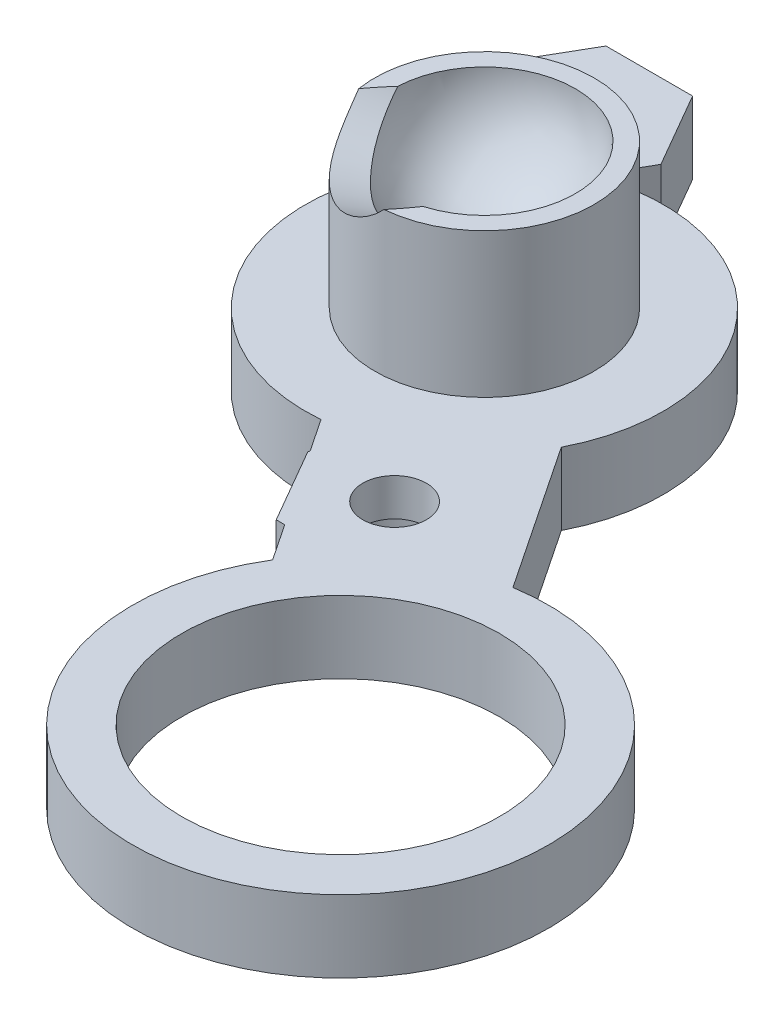
ISO-10303-21;
HEADER;
FILE_DESCRIPTION(('STEP AP214'),'2;1');
FILE_NAME('part.step','',(''),(''),'','','');
FILE_SCHEMA(('AUTOMOTIVE_DESIGN { 1 0 10303 214 1 1 1 1 }'));
ENDSEC;
DATA;
#1=APPLICATION_CONTEXT('core data for automotive mechanical design processes');
#2=APPLICATION_PROTOCOL_DEFINITION('international standard','automotive_design',2000,#1);
#3=PRODUCT_CONTEXT('',#1,'mechanical');
#4=PRODUCT('Part','Part','',(#3));
#5=PRODUCT_RELATED_PRODUCT_CATEGORY('part','',(#4));
#6=PRODUCT_DEFINITION_FORMATION('','',#4);
#7=PRODUCT_DEFINITION_CONTEXT('part definition',#1,'design');
#8=PRODUCT_DEFINITION('design','',#6,#7);
#9=PRODUCT_DEFINITION_SHAPE('','',#8);
#10=(LENGTH_UNIT() NAMED_UNIT(*) SI_UNIT(.MILLI.,.METRE.));
#11=(NAMED_UNIT(*) PLANE_ANGLE_UNIT() SI_UNIT($,.RADIAN.));
#12=(NAMED_UNIT(*) SI_UNIT($,.STERADIAN.) SOLID_ANGLE_UNIT());
#13=UNCERTAINTY_MEASURE_WITH_UNIT(LENGTH_MEASURE(1.E-05),#10,'distance_accuracy_value','');
#14=(GEOMETRIC_REPRESENTATION_CONTEXT(3) GLOBAL_UNCERTAINTY_ASSIGNED_CONTEXT((#13)) GLOBAL_UNIT_ASSIGNED_CONTEXT((#10,
#11,#12)) REPRESENTATION_CONTEXT('',''));
#15=CARTESIAN_POINT('',(0.,0.,0.));
#16=DIRECTION('',(0.,0.,1.));
#17=DIRECTION('',(1.,0.,0.));
#18=AXIS2_PLACEMENT_3D('',#15,#16,#17);
#19=CARTESIAN_POINT('',(-26.0608891324554,-108.75,-7.63878406783228));
#20=DIRECTION('',(0.,1.,0.));
#21=DIRECTION('',(0.,0.,1.));
#22=AXIS2_PLACEMENT_3D('',#19,#20,#21);
#23=CYLINDRICAL_SURFACE('',#22,1.1);
#24=CARTESIAN_POINT('',(-26.0608891324554,-106.,-7.63878406783228));
#25=DIRECTION('',(0.,-1.,0.));
#26=DIRECTION('',(0.,0.,-1.));
#27=AXIS2_PLACEMENT_3D('',#24,#25,#26);
#28=CIRCLE('',#27,1.1);
#29=CARTESIAN_POINT('',(-26.0608891324554,-106.,-8.73878406783228));
#30=VERTEX_POINT('',#29);
#31=EDGE_CURVE('E203',#30,#30,#28,.F.);
#32=ORIENTED_EDGE('',*,*,#31,.T.);
#33=EDGE_LOOP('',(#32));
#34=FACE_BOUND('',#33,.T.);
#35=CARTESIAN_POINT('',(-26.0608891324554,-107.3,-7.63878406783228));
#36=DIRECTION('',(0.,-1.,0.));
#37=DIRECTION('',(0.,0.,-1.));
#38=AXIS2_PLACEMENT_3D('',#35,#36,#37);
#39=CIRCLE('',#38,1.1);
#40=CARTESIAN_POINT('',(-26.0608891324554,-107.3,-8.73878406783228));
#41=VERTEX_POINT('',#40);
#42=EDGE_CURVE('E210',#41,#41,#39,.T.);
#43=ORIENTED_EDGE('',*,*,#42,.T.);
#44=EDGE_LOOP('',(#43));
#45=FACE_BOUND('',#44,.T.);
#46=ADVANCED_FACE('F41',(#34,#45),#23,.F.);
#47=CARTESIAN_POINT('',(-34.5608891324554,-108.75,-22.3612159321677));
#48=DIRECTION('',(0.,1.,0.));
#49=DIRECTION('',(0.,0.,1.));
#50=AXIS2_PLACEMENT_3D('',#47,#48,#49);
#51=CYLINDRICAL_SURFACE('',#50,1.1);
#52=CARTESIAN_POINT('',(-34.5608891324554,-106.,-22.3612159321677));
#53=DIRECTION('',(0.,-1.,0.));
#54=DIRECTION('',(0.,0.,-1.));
#55=AXIS2_PLACEMENT_3D('',#52,#53,#54);
#56=CIRCLE('',#55,1.1);
#57=CARTESIAN_POINT('',(-34.5608891324554,-106.,-23.4612159321677));
#58=VERTEX_POINT('',#57);
#59=EDGE_CURVE('E195',#58,#58,#56,.F.);
#60=ORIENTED_EDGE('',*,*,#59,.T.);
#61=EDGE_LOOP('',(#60));
#62=FACE_BOUND('',#61,.T.);
#63=CARTESIAN_POINT('',(-34.5608891324554,-107.3,-22.3612159321677));
#64=DIRECTION('',(0.,-1.,0.));
#65=DIRECTION('',(0.,0.,-1.));
#66=AXIS2_PLACEMENT_3D('',#63,#64,#65);
#67=CIRCLE('',#66,1.1);
#68=CARTESIAN_POINT('',(-34.5608891324554,-107.3,-23.4612159321677));
#69=VERTEX_POINT('',#68);
#70=EDGE_CURVE('E200',#69,#69,#67,.T.);
#71=ORIENTED_EDGE('',*,*,#70,.T.);
#72=EDGE_LOOP('',(#71));
#73=FACE_BOUND('',#72,.T.);
#74=ADVANCED_FACE('F346',(#62,#73),#51,.F.);
#75=CARTESIAN_POINT('',(-22.7863244619095,-108.5,1.66631495995398));
#76=DIRECTION('',(0.83155773864033,0.,-0.555438319984659));
#77=DIRECTION('',(-0.555438319984659,0.,-0.83155773864033));
#78=AXIS2_PLACEMENT_3D('',#75,#76,#77);
#79=PLANE('',#78);
#80=DIRECTION('',(0.,1.,0.));
#81=VECTOR('',#80,1.);
#82=CARTESIAN_POINT('',(-26.4217944999992,-108.5,-3.77641942656093));
#83=LINE('',#82,#81);
#84=CARTESIAN_POINT('',(-26.4217944999992,-106.,-3.77641942656093));
#85=VERTEX_POINT('',#84);
#86=CARTESIAN_POINT('',(-26.4217944999992,-108.5,-3.77641942656093));
#87=VERTEX_POINT('',#86);
#88=EDGE_CURVE('E241',#85,#87,#83,.F.);
#89=ORIENTED_EDGE('',*,*,#88,.F.);
#90=DIRECTION('',(-0.555438319984659,0.,-0.83155773864033));
#91=VECTOR('',#90,1.);
#92=CARTESIAN_POINT('',(-22.7863244619095,-106.,1.66631495995398));
#93=LINE('',#92,#91);
#94=CARTESIAN_POINT('',(-27.266274935763,-106.,-5.04070785647896));
#95=VERTEX_POINT('',#94);
#96=EDGE_CURVE('E249',#85,#95,#93,.T.);
#97=ORIENTED_EDGE('',*,*,#96,.T.);
#98=DIRECTION('',(0.,-1.,0.));
#99=VECTOR('',#98,1.);
#100=CARTESIAN_POINT('',(-27.266274935763,-108.5,-5.04070785647896));
#101=LINE('',#100,#99);
#102=CARTESIAN_POINT('',(-27.266274935763,-108.5,-5.04070785647896));
#103=VERTEX_POINT('',#102);
#104=EDGE_CURVE('E184',#95,#103,#101,.T.);
#105=ORIENTED_EDGE('',*,*,#104,.T.);
#106=DIRECTION('',(-0.555438319984659,0.,-0.83155773864033));
#107=VECTOR('',#106,1.);
#108=CARTESIAN_POINT('',(-22.7863244619095,-108.5,1.66631495995398));
#109=LINE('',#108,#107);
#110=EDGE_CURVE('E63',#87,#103,#109,.T.);
#111=ORIENTED_EDGE('',*,*,#110,.F.);
#112=EDGE_LOOP('',(#89,#97,#105,#111));
#113=FACE_BOUND('',#112,.T.);
#114=ADVANCED_FACE('F358',(#113),#79,.F.);
#115=CARTESIAN_POINT('',(-27.8162159165344,-108.5,-16.666314959954));
#116=DIRECTION('',(-0.83155773864033,0.,0.555438319984659));
#117=DIRECTION('',(0.555438319984659,0.,0.83155773864033));
#118=AXIS2_PLACEMENT_3D('',#115,#116,#117);
#119=PLANE('',#118);
#120=DIRECTION('',(0.,1.,0.));
#121=VECTOR('',#120,1.);
#122=CARTESIAN_POINT('',(-21.4324480681573,-108.5,-7.10904934646889));
#123=LINE('',#122,#121);
#124=CARTESIAN_POINT('',(-21.4324480681573,-108.5,-7.10904934646889));
#125=VERTEX_POINT('',#124);
#126=CARTESIAN_POINT('',(-21.4324480681573,-106.,-7.10904934646889));
#127=VERTEX_POINT('',#126);
#128=EDGE_CURVE('E49',#125,#127,#123,.T.);
#129=ORIENTED_EDGE('',*,*,#128,.F.);
#130=DIRECTION('',(0.555438319984659,0.,0.83155773864033));
#131=VECTOR('',#130,1.);
#132=CARTESIAN_POINT('',(-27.8162159165344,-108.5,-16.666314959954));
#133=LINE('',#132,#131);
#134=CARTESIAN_POINT('',(-24.8024831394074,-108.5,-12.1543957731699));
#135=VERTEX_POINT('',#134);
#136=EDGE_CURVE('E246',#135,#125,#133,.T.);
#137=ORIENTED_EDGE('',*,*,#136,.F.);
#138=DIRECTION('',(0.,1.,0.));
#139=VECTOR('',#138,1.);
#140=CARTESIAN_POINT('',(-24.8024831394074,-108.5,-12.1543957731699));
#141=LINE('',#140,#139);
#142=CARTESIAN_POINT('',(-24.8024831394074,-106.,-12.1543957731699));
#143=VERTEX_POINT('',#142);
#144=EDGE_CURVE('E172',#135,#143,#141,.T.);
#145=ORIENTED_EDGE('',*,*,#144,.T.);
#146=DIRECTION('',(0.555438319984659,0.,0.83155773864033));
#147=VECTOR('',#146,1.);
#148=CARTESIAN_POINT('',(-27.8162159165344,-106.,-16.666314959954));
#149=LINE('',#148,#147);
#150=EDGE_CURVE('E244',#143,#127,#149,.T.);
#151=ORIENTED_EDGE('',*,*,#150,.T.);
#152=EDGE_LOOP('',(#129,#137,#145,#151));
#153=FACE_BOUND('',#152,.T.);
#154=ADVANCED_FACE('F382',(#153),#119,.F.);
#155=CARTESIAN_POINT('',(-30.3108891324554,-108.5,-15.));
#156=DIRECTION('',(0.,1.,0.));
#157=DIRECTION('',(0.,0.,1.));
#158=AXIS2_PLACEMENT_3D('',#155,#156,#157);
#159=CYLINDRICAL_SURFACE('',#158,6.2);
#160=DIRECTION('',(0.,1.,0.));
#161=VECTOR('',#160,1.);
#162=CARTESIAN_POINT('',(-29.7918295712494,-108.5,-8.8217658532619));
#163=LINE('',#162,#161);
#164=CARTESIAN_POINT('',(-29.7918295712494,-106.,-8.8217658532619));
#165=VERTEX_POINT('',#164);
#166=CARTESIAN_POINT('',(-29.7918295712494,-108.5,-8.8217658532619));
#167=VERTEX_POINT('',#166);
#168=EDGE_CURVE('E177',#165,#167,#163,.F.);
#169=ORIENTED_EDGE('',*,*,#168,.F.);
#170=CARTESIAN_POINT('',(-30.3108891324554,-106.,-15.));
#171=DIRECTION('',(0.,-1.,0.));
#172=DIRECTION('',(0.,0.,-1.));
#173=AXIS2_PLACEMENT_3D('',#170,#171,#172);
#174=CIRCLE('',#173,6.2);
#175=CARTESIAN_POINT('',(-34.2798310569486,-106.,-19.7631397208144));
#176=VERTEX_POINT('',#175);
#177=EDGE_CURVE('E322',#165,#176,#174,.T.);
#178=ORIENTED_EDGE('',*,*,#177,.T.);
#179=DIRECTION('',(0.,1.,0.));
#180=VECTOR('',#179,1.);
#181=CARTESIAN_POINT('',(-34.2798310569486,-108.5,-19.7631397208144));
#182=LINE('',#181,#180);
#183=CARTESIAN_POINT('',(-34.2798310569486,-108.5,-19.7631397208144));
#184=VERTEX_POINT('',#183);
#185=EDGE_CURVE('E316',#184,#176,#182,.T.);
#186=ORIENTED_EDGE('',*,*,#185,.F.);
#187=CARTESIAN_POINT('',(-30.3108891324554,-108.5,-15.));
#188=DIRECTION('',(0.,-1.,0.));
#189=DIRECTION('',(0.,0.,-1.));
#190=AXIS2_PLACEMENT_3D('',#187,#188,#189);
#191=CIRCLE('',#190,6.2);
#192=EDGE_CURVE('E329',#167,#184,#191,.T.);
#193=ORIENTED_EDGE('',*,*,#192,.F.);
#194=EDGE_LOOP('',(#169,#178,#186,#193));
#195=FACE_BOUND('',#194,.T.);
#196=ADVANCED_FACE('F381',(#195),#159,.T.);
#197=ORIENTED_EDGE('',*,*,#144,.F.);
#198=CARTESIAN_POINT('',(-32.4514181702087,-108.5,-20.8187743931635));
#199=VERTEX_POINT('',#198);
#200=EDGE_CURVE('E328',#199,#135,#191,.T.);
#201=ORIENTED_EDGE('',*,*,#200,.F.);
#202=DIRECTION('',(0.,1.,0.));
#203=VECTOR('',#202,1.);
#204=CARTESIAN_POINT('',(-32.4514181702087,-108.5,-20.8187743931635));
#205=LINE('',#204,#203);
#206=CARTESIAN_POINT('',(-32.4514181702087,-106.,-20.8187743931635));
#207=VERTEX_POINT('',#206);
#208=EDGE_CURVE('E321',#207,#199,#205,.F.);
#209=ORIENTED_EDGE('',*,*,#208,.F.);
#210=EDGE_CURVE('E327',#207,#143,#174,.T.);
#211=ORIENTED_EDGE('',*,*,#210,.T.);
#212=EDGE_LOOP('',(#197,#201,#209,#211));
#213=FACE_BOUND('',#212,.T.);
#214=ADVANCED_FACE('F393',(#213),#159,.T.);
#215=CARTESIAN_POINT('',(-29.0608891324554,-108.5,-7.63878406783228));
#216=DIRECTION('',(0.866025403784438,0.,0.5));
#217=DIRECTION('',(0.5,0.,-0.866025403784438));
#218=AXIS2_PLACEMENT_3D('',#215,#216,#217);
#219=PLANE('',#218);
#220=DIRECTION('',(0.,1.,0.));
#221=VECTOR('',#220,1.);
#222=CARTESIAN_POINT('',(-29.0334281064459,-108.5,-7.68634796010869));
#223=LINE('',#222,#221);
#224=CARTESIAN_POINT('',(-29.0334281064459,-108.5,-7.68634796010869));
#225=VERTEX_POINT('',#224);
#226=CARTESIAN_POINT('',(-29.0334281064459,-106.,-7.68634796010869));
#227=VERTEX_POINT('',#226);
#228=EDGE_CURVE('E255',#225,#227,#223,.T.);
#229=ORIENTED_EDGE('',*,*,#228,.F.);
#230=DIRECTION('',(0.5,0.,-0.866025403784438));
#231=VECTOR('',#230,1.);
#232=CARTESIAN_POINT('',(-29.0608891324554,-108.5,-7.63878406783228));
#233=LINE('',#232,#231);
#234=CARTESIAN_POINT('',(-29.0608891324554,-108.5,-7.63878406783228));
#235=VERTEX_POINT('',#234);
#236=EDGE_CURVE('E262',#235,#225,#233,.T.);
#237=ORIENTED_EDGE('',*,*,#236,.F.);
#238=DIRECTION('',(0.,1.,0.));
#239=VECTOR('',#238,1.);
#240=CARTESIAN_POINT('',(-29.0608891324554,-108.5,-7.63878406783228));
#241=LINE('',#240,#239);
#242=CARTESIAN_POINT('',(-29.0608891324554,-106.,-7.63878406783228));
#243=VERTEX_POINT('',#242);
#244=EDGE_CURVE('E270',#235,#243,#241,.T.);
#245=ORIENTED_EDGE('',*,*,#244,.T.);
#246=DIRECTION('',(0.5,0.,-0.866025403784438));
#247=VECTOR('',#246,1.);
#248=CARTESIAN_POINT('',(-29.0608891324554,-106.,-7.63878406783228));
#249=LINE('',#248,#247);
#250=EDGE_CURVE('E261',#243,#227,#249,.T.);
#251=ORIENTED_EDGE('',*,*,#250,.T.);
#252=EDGE_LOOP('',(#229,#237,#245,#251));
#253=FACE_BOUND('',#252,.T.);
#254=ADVANCED_FACE('F343',(#253),#219,.F.);
#255=CARTESIAN_POINT('',(-24.5608891324554,-108.5,-5.04070785647896));
#256=DIRECTION('',(0.,0.,-1.));
#257=DIRECTION('',(-1.,0.,0.));
#258=AXIS2_PLACEMENT_3D('',#255,#256,#257);
#259=PLANE('',#258);
#260=ORIENTED_EDGE('',*,*,#104,.F.);
#261=DIRECTION('',(-1.,0.,0.));
#262=VECTOR('',#261,1.);
#263=CARTESIAN_POINT('',(-24.5608891324554,-106.,-5.04070785647896));
#264=LINE('',#263,#262);
#265=CARTESIAN_POINT('',(-27.5608891324554,-106.,-5.04070785647896));
#266=VERTEX_POINT('',#265);
#267=EDGE_CURVE('E173',#95,#266,#264,.T.);
#268=ORIENTED_EDGE('',*,*,#267,.T.);
#269=DIRECTION('',(0.,1.,0.));
#270=VECTOR('',#269,1.);
#271=CARTESIAN_POINT('',(-27.5608891324554,-108.5,-5.04070785647896));
#272=LINE('',#271,#270);
#273=CARTESIAN_POINT('',(-27.5608891324554,-108.5,-5.04070785647896));
#274=VERTEX_POINT('',#273);
#275=EDGE_CURVE('E271',#274,#266,#272,.T.);
#276=ORIENTED_EDGE('',*,*,#275,.F.);
#277=DIRECTION('',(-1.,0.,0.));
#278=VECTOR('',#277,1.);
#279=CARTESIAN_POINT('',(-24.5608891324554,-108.5,-5.04070785647896));
#280=LINE('',#279,#278);
#281=EDGE_CURVE('E257',#103,#274,#280,.T.);
#282=ORIENTED_EDGE('',*,*,#281,.F.);
#283=EDGE_LOOP('',(#260,#268,#276,#282));
#284=FACE_BOUND('',#283,.T.);
#285=ADVANCED_FACE('F336',(#284),#259,.F.);
#286=CARTESIAN_POINT('',(-30.3108891324554,-106.02,-15.));
#287=DIRECTION('',(0.,1.,0.));
#288=DIRECTION('',(0.,0.,1.));
#289=AXIS2_PLACEMENT_3D('',#286,#287,#288);
#290=CYLINDRICAL_SURFACE('',#289,3.8);
#291=CARTESIAN_POINT('',(-30.3108891324554,-101.,-15.));
#292=DIRECTION('',(0.,-1.,0.));
#293=DIRECTION('',(0.,0.,-1.));
#294=AXIS2_PLACEMENT_3D('',#291,#292,#293);
#295=CIRCLE('',#294,3.8);
#296=CARTESIAN_POINT('',(-34.0630722359518,-101.,-14.3990657624698));
#297=VERTEX_POINT('',#296);
#298=CARTESIAN_POINT('',(-29.9992809717437,-101.,-11.2127978197385));
#299=VERTEX_POINT('',#298);
#300=EDGE_CURVE('E169',#297,#299,#295,.T.);
#301=ORIENTED_EDGE('',*,*,#300,.T.);
#302=CARTESIAN_POINT('',(-29.9990936060594,-100.9998,-11.2128132407129));
#303=CARTESIAN_POINT('',(-30.0670392282905,-101.072342110152,-11.2071924317569));
#304=CARTESIAN_POINT('',(-30.1384427308652,-101.141737029236,-11.2031800244121));
#305=CARTESIAN_POINT('',(-30.2870375597555,-101.2741615165,-11.1993554575045));
#306=CARTESIAN_POINT('',(-30.3642290028478,-101.337190956191,-11.1995433827097));
#307=CARTESIAN_POINT('',(-30.5233696196391,-101.456886305187,-11.2051067512917));
#308=CARTESIAN_POINT('',(-30.6053246932024,-101.513544056817,-11.2104887621023));
#309=CARTESIAN_POINT('',(-30.7727850652044,-101.620336946865,-11.2272389157684));
#310=CARTESIAN_POINT('',(-30.8582897715052,-101.670473167462,-11.23860606387));
#311=CARTESIAN_POINT('',(-31.0216894112094,-101.75869968596,-11.2662599660654));
#312=CARTESIAN_POINT('',(-31.0993178157952,-101.797512633648,-11.2818238865246));
#313=CARTESIAN_POINT('',(-31.2557187213186,-101.86987515176,-11.3184588376373));
#314=CARTESIAN_POINT('',(-31.3344911058838,-101.903425253509,-11.3395293117879));
#315=CARTESIAN_POINT('',(-31.4922763385444,-101.96510164616,-11.3873679983923));
#316=CARTESIAN_POINT('',(-31.571288604743,-101.9932364806,-11.4141270932981));
#317=CARTESIAN_POINT('',(-31.728886955565,-102.044024535532,-11.4734761286719));
#318=CARTESIAN_POINT('',(-31.8074730591716,-102.066678002182,-11.5060658071858));
#319=CARTESIAN_POINT('',(-31.9595066922925,-102.105385136737,-11.5752835984315));
#320=CARTESIAN_POINT('',(-32.0330141390325,-102.121713025434,-11.6116268569451));
#321=CARTESIAN_POINT('',(-32.1782807288927,-102.149229670343,-11.6894649814123));
#322=CARTESIAN_POINT('',(-32.2500392185365,-102.160416532726,-11.730961738651));
#323=CARTESIAN_POINT('',(-32.3911105144319,-102.17756924396,-11.8188713638396));
#324=CARTESIAN_POINT('',(-32.4604239519339,-102.183536450003,-11.865282950337));
#325=CARTESIAN_POINT('',(-32.5960174010497,-102.190221249505,-11.9627025238169));
#326=CARTESIAN_POINT('',(-32.6622963284864,-102.190936981028,-12.013712134564));
#327=CARTESIAN_POINT('',(-32.8472967398228,-102.185424591192,-12.1661119153657));
#328=CARTESIAN_POINT('',(-32.9615974696543,-102.172629334172,-12.2727976450869));
#329=CARTESIAN_POINT('',(-33.1745270586437,-102.128913957544,-12.4972898067947));
#330=CARTESIAN_POINT('',(-33.2731601317283,-102.09799872196,-12.6150932349635));
#331=CARTESIAN_POINT('',(-33.4533840421461,-102.018550534102,-12.8581161439467));
#332=CARTESIAN_POINT('',(-33.5349255115896,-101.969967626041,-12.9833558022623));
#333=CARTESIAN_POINT('',(-33.6801021732066,-101.855858350757,-13.236556615624));
#334=CARTESIAN_POINT('',(-33.7437224355728,-101.790317943255,-13.3645199448262));
#335=CARTESIAN_POINT('',(-33.8571883347709,-101.638024621455,-13.6268602833714));
#336=CARTESIAN_POINT('',(-33.9058429852257,-101.550154500005,-13.7611009471761));
#337=CARTESIAN_POINT('',(-33.985209486157,-101.356314064967,-14.0213209405645));
#338=CARTESIAN_POINT('',(-34.0159551600863,-101.250378363221,-14.1473154418161));
#339=CARTESIAN_POINT('',(-34.0438114477498,-101.113686188711,-14.2887764793012));
#340=CARTESIAN_POINT('',(-34.0480257754014,-101.091350519122,-14.3112884456115));
#341=CARTESIAN_POINT('',(-34.0559398230363,-101.046051944822,-14.3557176626996));
#342=CARTESIAN_POINT('',(-34.0596400621782,-101.023089701324,-14.3776354951944));
#343=CARTESIAN_POINT('',(-34.063101961667,-100.9998,-14.3992513967554));
#344=B_SPLINE_CURVE_WITH_KNOTS('',3,(#302,#303,#304,#305,#306,#307,#308,#309,#310,#311,#312,
#313,#314,#315,#316,#317,#318,#319,#320,#321,#322,#323,#324,#325,#326,#327,#328,#329,#330,#331,
#332,#333,#334,#335,#336,#337,#338,#339,#340,#341,#342,#343),.UNSPECIFIED.,.F.,.F.,(4,2,2,2,2,2,
2,2,2,2,2,2,2,2,2,2,2,2,2,2,4),(0.,0.298502367110102,0.597010758387164,0.895897080679035,
1.19473374252968,1.45893687456312,1.72311331603081,1.9868694935179,2.25061382405023,
2.50111827840569,2.75171493870102,3.00224642058703,3.25286672539199,3.72104449842141,
4.18909613775274,4.65848162776413,5.12825700492775,5.62913773764794,6.12906939821765,
6.22503537633674,6.32090372644162),.UNSPECIFIED.);
#345=EDGE_CURVE('E167',#299,#297,#344,.T.);
#346=ORIENTED_EDGE('',*,*,#345,.T.);
#347=EDGE_LOOP('',(#301,#346));
#348=FACE_BOUND('',#347,.T.);
#349=CARTESIAN_POINT('',(-30.3108891324554,-106.,-15.));
#350=DIRECTION('',(0.,-1.,0.));
#351=DIRECTION('',(0.,0.,-1.));
#352=AXIS2_PLACEMENT_3D('',#349,#350,#351);
#353=CIRCLE('',#352,3.8);
#354=CARTESIAN_POINT('',(-30.3108891324554,-106.,-18.8));
#355=VERTEX_POINT('',#354);
#356=EDGE_CURVE('E182',#355,#355,#353,.T.);
#357=ORIENTED_EDGE('',*,*,#356,.F.);
#358=EDGE_LOOP('',(#357));
#359=FACE_BOUND('',#358,.T.);
#360=ADVANCED_FACE('F43',(#348,#359),#290,.T.);
#361=CARTESIAN_POINT('',(-30.3108891324554,-101.,-15.));
#362=DIRECTION('',(0.,-1.,0.));
#363=DIRECTION('',(0.,0.,-1.));
#364=AXIS2_PLACEMENT_3D('',#361,#362,#363);
#365=PLANE('',#364);
#366=ORIENTED_EDGE('',*,*,#300,.F.);
#367=CARTESIAN_POINT('',(-31.835817099933,-101.,-13.0550948431946));
#368=DIRECTION('',(0.,-1.,0.));
#369=DIRECTION('',(-0.617017715423195,0.,0.786949260660394));
#370=AXIS2_PLACEMENT_3D('',#367,#368,#369);
#371=ELLIPSE('',#370,5.40311255334571,2.58643522865266);
#372=CARTESIAN_POINT('',(-33.4573814589928,-101.,-15.1486137242689));
#373=VERTEX_POINT('',#372);
#374=EDGE_CURVE('E159',#297,#373,#371,.T.);
#375=ORIENTED_EDGE('',*,*,#374,.T.);
#376=CARTESIAN_POINT('',(-30.3108891324554,-101.,-15.));
#377=DIRECTION('',(0.,-1.,0.));
#378=DIRECTION('',(0.,0.,-1.));
#379=AXIS2_PLACEMENT_3D('',#376,#377,#378);
#380=CIRCLE('',#379,3.15);
#381=CARTESIAN_POINT('',(-29.4158821665001,-101.,-11.9798240894128));
#382=VERTEX_POINT('',#381);
#383=EDGE_CURVE('E170',#373,#382,#380,.T.);
#384=ORIENTED_EDGE('',*,*,#383,.T.);
#385=EDGE_CURVE('E60',#382,#299,#371,.T.);
#386=ORIENTED_EDGE('',*,*,#385,.T.);
#387=EDGE_LOOP('',(#366,#375,#384,#386));
#388=FACE_BOUND('',#387,.T.);
#389=ADVANCED_FACE('F168',(#388),#365,.F.);
#390=CARTESIAN_POINT('',(-30.3108891324554,-108.5,-15.));
#391=DIRECTION('',(0.,-1.,0.));
#392=DIRECTION('',(0.,0.,-1.));
#393=AXIS2_PLACEMENT_3D('',#390,#391,#392);
#394=PLANE('',#393);
#395=CARTESIAN_POINT('',(-26.0608891324554,-108.5,-7.63878406783228));
#396=DIRECTION('',(0.,-1.,0.));
#397=DIRECTION('',(0.,0.,-1.));
#398=AXIS2_PLACEMENT_3D('',#395,#396,#397);
#399=CIRCLE('',#398,2.1);
#400=CARTESIAN_POINT('',(-26.0608891324554,-108.5,-9.73878406783228));
#401=VERTEX_POINT('',#400);
#402=EDGE_CURVE('E207',#401,#401,#399,.F.);
#403=ORIENTED_EDGE('',*,*,#402,.T.);
#404=EDGE_LOOP('',(#403));
#405=FACE_BOUND('',#404,.T.);
#406=CARTESIAN_POINT('',(-34.5608891324554,-108.5,-22.3612159321677));
#407=DIRECTION('',(0.,-1.,0.));
#408=DIRECTION('',(0.,0.,-1.));
#409=AXIS2_PLACEMENT_3D('',#406,#407,#408);
#410=CIRCLE('',#409,2.1);
#411=CARTESIAN_POINT('',(-34.5608891324554,-108.5,-24.4612159321677));
#412=VERTEX_POINT('',#411);
#413=EDGE_CURVE('E198',#412,#412,#410,.F.);
#414=ORIENTED_EDGE('',*,*,#413,.T.);
#415=EDGE_LOOP('',(#414));
#416=FACE_BOUND('',#415,.T.);
#417=CARTESIAN_POINT('',(-20.2916512459885,-108.5,0.));
#418=DIRECTION('',(0.,-1.,0.));
#419=DIRECTION('',(0.,0.,-1.));
#420=AXIS2_PLACEMENT_3D('',#417,#418,#419);
#421=CIRCLE('',#420,5.5);
#422=CARTESIAN_POINT('',(-20.2916512459885,-108.5,5.5));
#423=VERTEX_POINT('',#422);
#424=EDGE_CURVE('E191',#423,#423,#421,.F.);
#425=ORIENTED_EDGE('',*,*,#424,.T.);
#426=EDGE_LOOP('',(#425));
#427=FACE_BOUND('',#426,.T.);
#428=CARTESIAN_POINT('',(-20.2916512459885,-108.5,0.));
#429=DIRECTION('',(0.,-1.,0.));
#430=DIRECTION('',(0.,0.,-1.));
#431=AXIS2_PLACEMENT_3D('',#428,#429,#430);
#432=CIRCLE('',#431,7.2);
#433=EDGE_CURVE('E238',#125,#87,#432,.T.);
#434=ORIENTED_EDGE('',*,*,#433,.T.);
#435=ORIENTED_EDGE('',*,*,#110,.T.);
#436=ORIENTED_EDGE('',*,*,#281,.T.);
#437=DIRECTION('',(-0.5,0.,-0.866025403784439));
#438=VECTOR('',#437,1.);
#439=CARTESIAN_POINT('',(-27.5608891324554,-108.5,-5.04070785647896));
#440=LINE('',#439,#438);
#441=EDGE_CURVE('E265',#274,#235,#440,.T.);
#442=ORIENTED_EDGE('',*,*,#441,.T.);
#443=ORIENTED_EDGE('',*,*,#236,.T.);
#444=EDGE_CURVE('E248',#225,#167,#109,.T.);
#445=ORIENTED_EDGE('',*,*,#444,.T.);
#446=ORIENTED_EDGE('',*,*,#192,.T.);
#447=DIRECTION('',(-1.,0.,0.));
#448=VECTOR('',#447,1.);
#449=CARTESIAN_POINT('',(-33.0608891324554,-108.5,-19.7631397208144));
#450=LINE('',#449,#448);
#451=CARTESIAN_POINT('',(-36.0608891324554,-108.5,-19.7631397208144));
#452=VERTEX_POINT('',#451);
#453=EDGE_CURVE('E284',#184,#452,#450,.T.);
#454=ORIENTED_EDGE('',*,*,#453,.T.);
#455=DIRECTION('',(-0.5,0.,-0.866025403784439));
#456=VECTOR('',#455,1.);
#457=CARTESIAN_POINT('',(-36.0608891324554,-108.5,-19.7631397208144));
#458=LINE('',#457,#456);
#459=CARTESIAN_POINT('',(-37.5608891324554,-108.5,-22.3612159321677));
#460=VERTEX_POINT('',#459);
#461=EDGE_CURVE('E287',#452,#460,#458,.T.);
#462=ORIENTED_EDGE('',*,*,#461,.T.);
#463=DIRECTION('',(0.500000000000001,0.,-0.866025403784438));
#464=VECTOR('',#463,1.);
#465=CARTESIAN_POINT('',(-37.5608891324554,-108.5,-22.3612159321677));
#466=LINE('',#465,#464);
#467=CARTESIAN_POINT('',(-36.0608891324554,-108.5,-24.9592921435211));
#468=VERTEX_POINT('',#467);
#469=EDGE_CURVE('E288',#460,#468,#466,.T.);
#470=ORIENTED_EDGE('',*,*,#469,.T.);
#471=DIRECTION('',(1.,0.,0.));
#472=VECTOR('',#471,1.);
#473=CARTESIAN_POINT('',(-36.0608891324554,-108.5,-24.9592921435211));
#474=LINE('',#473,#472);
#475=CARTESIAN_POINT('',(-33.0608891324554,-108.5,-24.9592921435211));
#476=VERTEX_POINT('',#475);
#477=EDGE_CURVE('E286',#468,#476,#474,.T.);
#478=ORIENTED_EDGE('',*,*,#477,.T.);
#479=DIRECTION('',(0.500000000000001,0.,0.866025403784438));
#480=VECTOR('',#479,1.);
#481=CARTESIAN_POINT('',(-33.0608891324554,-108.5,-24.9592921435211));
#482=LINE('',#481,#480);
#483=CARTESIAN_POINT('',(-31.5608891324554,-108.5,-22.3612159321677));
#484=VERTEX_POINT('',#483);
#485=EDGE_CURVE('E276',#476,#484,#482,.T.);
#486=ORIENTED_EDGE('',*,*,#485,.T.);
#487=DIRECTION('',(-0.5,0.,0.866025403784439));
#488=VECTOR('',#487,1.);
#489=CARTESIAN_POINT('',(-31.5608891324554,-108.5,-22.3612159321677));
#490=LINE('',#489,#488);
#491=EDGE_CURVE('E277',#484,#199,#490,.T.);
#492=ORIENTED_EDGE('',*,*,#491,.T.);
#493=ORIENTED_EDGE('',*,*,#200,.T.);
#494=ORIENTED_EDGE('',*,*,#136,.T.);
#495=EDGE_LOOP('',(#434,#435,#436,#442,#443,#445,#446,#454,#462,#470,#478,#486,#492,#493,#494));
#496=FACE_BOUND('',#495,.T.);
#497=ADVANCED_FACE('F215',(#405,#416,#427,#496),#394,.T.);
#498=CARTESIAN_POINT('',(-30.3108891324554,-106.,-15.));
#499=DIRECTION('',(0.,-1.,0.));
#500=DIRECTION('',(0.,0.,-1.));
#501=AXIS2_PLACEMENT_3D('',#498,#499,#500);
#502=PLANE('',#501);
#503=ORIENTED_EDGE('',*,*,#31,.F.);
#504=EDGE_LOOP('',(#503));
#505=FACE_BOUND('',#504,.T.);
#506=ORIENTED_EDGE('',*,*,#59,.F.);
#507=EDGE_LOOP('',(#506));
#508=FACE_BOUND('',#507,.T.);
#509=CARTESIAN_POINT('',(-20.2916512459885,-106.,0.));
#510=DIRECTION('',(0.,-1.,0.));
#511=DIRECTION('',(0.,0.,-1.));
#512=AXIS2_PLACEMENT_3D('',#509,#510,#511);
#513=CIRCLE('',#512,5.5);
#514=CARTESIAN_POINT('',(-20.2916512459885,-106.,5.5));
#515=VERTEX_POINT('',#514);
#516=EDGE_CURVE('E186',#515,#515,#513,.F.);
#517=ORIENTED_EDGE('',*,*,#516,.F.);
#518=EDGE_LOOP('',(#517));
#519=FACE_BOUND('',#518,.T.);
#520=ORIENTED_EDGE('',*,*,#96,.F.);
#521=CARTESIAN_POINT('',(-20.2916512459885,-106.,0.));
#522=DIRECTION('',(0.,-1.,0.));
#523=DIRECTION('',(0.,0.,-1.));
#524=AXIS2_PLACEMENT_3D('',#521,#522,#523);
#525=CIRCLE('',#524,7.2);
#526=EDGE_CURVE('E240',#127,#85,#525,.T.);
#527=ORIENTED_EDGE('',*,*,#526,.F.);
#528=ORIENTED_EDGE('',*,*,#150,.F.);
#529=ORIENTED_EDGE('',*,*,#210,.F.);
#530=DIRECTION('',(-0.5,0.,0.866025403784439));
#531=VECTOR('',#530,1.);
#532=CARTESIAN_POINT('',(-31.5608891324554,-106.,-22.3612159321677));
#533=LINE('',#532,#531);
#534=CARTESIAN_POINT('',(-31.5608891324554,-106.,-22.3612159321677));
#535=VERTEX_POINT('',#534);
#536=EDGE_CURVE('E294',#535,#207,#533,.T.);
#537=ORIENTED_EDGE('',*,*,#536,.F.);
#538=DIRECTION('',(0.500000000000001,0.,0.866025403784438));
#539=VECTOR('',#538,1.);
#540=CARTESIAN_POINT('',(-33.0608891324554,-106.,-24.9592921435211));
#541=LINE('',#540,#539);
#542=CARTESIAN_POINT('',(-33.0608891324554,-106.,-24.9592921435211));
#543=VERTEX_POINT('',#542);
#544=EDGE_CURVE('E279',#543,#535,#541,.T.);
#545=ORIENTED_EDGE('',*,*,#544,.F.);
#546=DIRECTION('',(1.,0.,0.));
#547=VECTOR('',#546,1.);
#548=CARTESIAN_POINT('',(-36.0608891324554,-106.,-24.9592921435211));
#549=LINE('',#548,#547);
#550=CARTESIAN_POINT('',(-36.0608891324554,-106.,-24.9592921435211));
#551=VERTEX_POINT('',#550);
#552=EDGE_CURVE('E283',#551,#543,#549,.T.);
#553=ORIENTED_EDGE('',*,*,#552,.F.);
#554=DIRECTION('',(0.500000000000001,0.,-0.866025403784438));
#555=VECTOR('',#554,1.);
#556=CARTESIAN_POINT('',(-37.5608891324554,-106.,-22.3612159321677));
#557=LINE('',#556,#555);
#558=CARTESIAN_POINT('',(-37.5608891324554,-106.,-22.3612159321677));
#559=VERTEX_POINT('',#558);
#560=EDGE_CURVE('E305',#559,#551,#557,.T.);
#561=ORIENTED_EDGE('',*,*,#560,.F.);
#562=DIRECTION('',(-0.5,0.,-0.866025403784439));
#563=VECTOR('',#562,1.);
#564=CARTESIAN_POINT('',(-36.0608891324554,-106.,-19.7631397208144));
#565=LINE('',#564,#563);
#566=CARTESIAN_POINT('',(-36.0608891324554,-106.,-19.7631397208144));
#567=VERTEX_POINT('',#566);
#568=EDGE_CURVE('E297',#567,#559,#565,.T.);
#569=ORIENTED_EDGE('',*,*,#568,.F.);
#570=DIRECTION('',(-1.,0.,0.));
#571=VECTOR('',#570,1.);
#572=CARTESIAN_POINT('',(-33.0608891324554,-106.,-19.7631397208144));
#573=LINE('',#572,#571);
#574=EDGE_CURVE('E296',#176,#567,#573,.T.);
#575=ORIENTED_EDGE('',*,*,#574,.F.);
#576=ORIENTED_EDGE('',*,*,#177,.F.);
#577=EDGE_CURVE('E251',#227,#165,#93,.T.);
#578=ORIENTED_EDGE('',*,*,#577,.F.);
#579=ORIENTED_EDGE('',*,*,#250,.F.);
#580=DIRECTION('',(-0.5,0.,-0.866025403784439));
#581=VECTOR('',#580,1.);
#582=CARTESIAN_POINT('',(-27.5608891324554,-106.,-5.04070785647896));
#583=LINE('',#582,#581);
#584=EDGE_CURVE('E176',#266,#243,#583,.T.);
#585=ORIENTED_EDGE('',*,*,#584,.F.);
#586=ORIENTED_EDGE('',*,*,#267,.F.);
#587=EDGE_LOOP('',(#520,#527,#528,#529,#537,#545,#553,#561,#569,#575,#576,#578,#579,#585,#586));
#588=FACE_BOUND('',#587,.T.);
#589=ORIENTED_EDGE('',*,*,#356,.T.);
#590=EDGE_LOOP('',(#589));
#591=FACE_BOUND('',#590,.T.);
#592=ADVANCED_FACE('F331',(#505,#508,#519,#588,#591),#502,.F.);
#593=CARTESIAN_POINT('',(-31.5608891324554,-108.5,-22.3612159321677));
#594=DIRECTION('',(-0.866025403784439,0.,-0.5));
#595=DIRECTION('',(-0.5,0.,0.866025403784439));
#596=AXIS2_PLACEMENT_3D('',#593,#594,#595);
#597=PLANE('',#596);
#598=ORIENTED_EDGE('',*,*,#536,.T.);
#599=ORIENTED_EDGE('',*,*,#208,.T.);
#600=ORIENTED_EDGE('',*,*,#491,.F.);
#601=DIRECTION('',(0.,1.,0.));
#602=VECTOR('',#601,1.);
#603=CARTESIAN_POINT('',(-31.5608891324554,-108.5,-22.3612159321677));
#604=LINE('',#603,#602);
#605=EDGE_CURVE('E317',#484,#535,#604,.T.);
#606=ORIENTED_EDGE('',*,*,#605,.T.);
#607=EDGE_LOOP('',(#598,#599,#600,#606));
#608=FACE_BOUND('',#607,.T.);
#609=ADVANCED_FACE('F415',(#608),#597,.F.);
#610=CARTESIAN_POINT('',(-33.0608891324554,-108.5,-19.7631397208144));
#611=DIRECTION('',(0.,0.,-1.));
#612=DIRECTION('',(-1.,0.,0.));
#613=AXIS2_PLACEMENT_3D('',#610,#611,#612);
#614=PLANE('',#613);
#615=ORIENTED_EDGE('',*,*,#453,.F.);
#616=ORIENTED_EDGE('',*,*,#185,.T.);
#617=ORIENTED_EDGE('',*,*,#574,.T.);
#618=DIRECTION('',(0.,1.,0.));
#619=VECTOR('',#618,1.);
#620=CARTESIAN_POINT('',(-36.0608891324554,-108.5,-19.7631397208144));
#621=LINE('',#620,#619);
#622=EDGE_CURVE('E312',#452,#567,#621,.T.);
#623=ORIENTED_EDGE('',*,*,#622,.F.);
#624=EDGE_LOOP('',(#615,#616,#617,#623));
#625=FACE_BOUND('',#624,.T.);
#626=ADVANCED_FACE('F408',(#625),#614,.F.);
#627=CARTESIAN_POINT('',(-33.0608891324554,-108.5,-24.9592921435211));
#628=DIRECTION('',(-0.866025403784438,0.,0.500000000000001));
#629=DIRECTION('',(0.500000000000001,0.,0.866025403784438));
#630=AXIS2_PLACEMENT_3D('',#627,#628,#629);
#631=PLANE('',#630);
#632=ORIENTED_EDGE('',*,*,#544,.T.);
#633=ORIENTED_EDGE('',*,*,#605,.F.);
#634=ORIENTED_EDGE('',*,*,#485,.F.);
#635=DIRECTION('',(0.,1.,0.));
#636=VECTOR('',#635,1.);
#637=CARTESIAN_POINT('',(-33.0608891324554,-108.5,-24.9592921435211));
#638=LINE('',#637,#636);
#639=EDGE_CURVE('E292',#476,#543,#638,.T.);
#640=ORIENTED_EDGE('',*,*,#639,.T.);
#641=EDGE_LOOP('',(#632,#633,#634,#640));
#642=FACE_BOUND('',#641,.T.);
#643=ADVANCED_FACE('F406',(#642),#631,.F.);
#644=CARTESIAN_POINT('',(-36.0608891324554,-108.5,-19.7631397208144));
#645=DIRECTION('',(0.866025403784439,0.,-0.5));
#646=DIRECTION('',(-0.5,0.,-0.866025403784439));
#647=AXIS2_PLACEMENT_3D('',#644,#645,#646);
#648=PLANE('',#647);
#649=ORIENTED_EDGE('',*,*,#568,.T.);
#650=DIRECTION('',(0.,1.,0.));
#651=VECTOR('',#650,1.);
#652=CARTESIAN_POINT('',(-37.5608891324554,-108.5,-22.3612159321677));
#653=LINE('',#652,#651);
#654=EDGE_CURVE('E309',#460,#559,#653,.T.);
#655=ORIENTED_EDGE('',*,*,#654,.F.);
#656=ORIENTED_EDGE('',*,*,#461,.F.);
#657=ORIENTED_EDGE('',*,*,#622,.T.);
#658=EDGE_LOOP('',(#649,#655,#656,#657));
#659=FACE_BOUND('',#658,.T.);
#660=ADVANCED_FACE('F401',(#659),#648,.F.);
#661=CARTESIAN_POINT('',(-37.5608891324554,-108.5,-22.3612159321677));
#662=DIRECTION('',(0.866025403784438,0.,0.500000000000001));
#663=DIRECTION('',(0.500000000000001,0.,-0.866025403784438));
#664=AXIS2_PLACEMENT_3D('',#661,#662,#663);
#665=PLANE('',#664);
#666=ORIENTED_EDGE('',*,*,#560,.T.);
#667=DIRECTION('',(0.,1.,0.));
#668=VECTOR('',#667,1.);
#669=CARTESIAN_POINT('',(-36.0608891324554,-108.5,-24.9592921435211));
#670=LINE('',#669,#668);
#671=EDGE_CURVE('E310',#468,#551,#670,.T.);
#672=ORIENTED_EDGE('',*,*,#671,.F.);
#673=ORIENTED_EDGE('',*,*,#469,.F.);
#674=ORIENTED_EDGE('',*,*,#654,.T.);
#675=EDGE_LOOP('',(#666,#672,#673,#674));
#676=FACE_BOUND('',#675,.T.);
#677=ADVANCED_FACE('F399',(#676),#665,.F.);
#678=CARTESIAN_POINT('',(-36.0608891324554,-108.5,-24.9592921435211));
#679=DIRECTION('',(0.,0.,1.));
#680=DIRECTION('',(1.,0.,0.));
#681=AXIS2_PLACEMENT_3D('',#678,#679,#680);
#682=PLANE('',#681);
#683=ORIENTED_EDGE('',*,*,#552,.T.);
#684=ORIENTED_EDGE('',*,*,#639,.F.);
#685=ORIENTED_EDGE('',*,*,#477,.F.);
#686=ORIENTED_EDGE('',*,*,#671,.T.);
#687=EDGE_LOOP('',(#683,#684,#685,#686));
#688=FACE_BOUND('',#687,.T.);
#689=ADVANCED_FACE('F394',(#688),#682,.F.);
#690=CARTESIAN_POINT('',(-27.5608891324554,-108.5,-5.04070785647896));
#691=DIRECTION('',(0.866025403784438,0.,-0.5));
#692=DIRECTION('',(-0.5,0.,-0.866025403784438));
#693=AXIS2_PLACEMENT_3D('',#690,#691,#692);
#694=PLANE('',#693);
#695=ORIENTED_EDGE('',*,*,#584,.T.);
#696=ORIENTED_EDGE('',*,*,#244,.F.);
#697=ORIENTED_EDGE('',*,*,#441,.F.);
#698=ORIENTED_EDGE('',*,*,#275,.T.);
#699=EDGE_LOOP('',(#695,#696,#697,#698));
#700=FACE_BOUND('',#699,.T.);
#701=ADVANCED_FACE('F390',(#700),#694,.F.);
#702=CARTESIAN_POINT('',(-30.3108891324554,-101.,-15.));
#703=DIRECTION('',(0.,0.,-1.));
#704=DIRECTION('',(-1.,0.,0.));
#705=AXIS2_PLACEMENT_3D('',#702,#703,#704);
#706=SPHERICAL_SURFACE('',#705,3.15);
#707=ORIENTED_EDGE('',*,*,#383,.F.);
#708=CARTESIAN_POINT('',(-31.1104183662697,-100.17230473673,-13.9802741093179));
#709=DIRECTION('',(0.51999029893439,-0.538308656109163,-0.663199728416765));
#710=DIRECTION('',(0.,0.776423951617283,-0.630210954645349));
#711=AXIS2_PLACEMENT_3D('',#708,#709,#710);
#712=CIRCLE('',#711,2.74924219800811);
#713=EDGE_CURVE('E11',#373,#382,#712,.F.);
#714=ORIENTED_EDGE('',*,*,#713,.T.);
#715=EDGE_LOOP('',(#707,#714));
#716=FACE_BOUND('',#715,.T.);
#717=ADVANCED_FACE('F175',(#716),#706,.F.);
#718=ORIENTED_EDGE('',*,*,#577,.T.);
#719=ORIENTED_EDGE('',*,*,#168,.T.);
#720=ORIENTED_EDGE('',*,*,#444,.F.);
#721=ORIENTED_EDGE('',*,*,#228,.T.);
#722=EDGE_LOOP('',(#718,#719,#720,#721));
#723=FACE_BOUND('',#722,.T.);
#724=ADVANCED_FACE('F376',(#723),#79,.F.);
#725=CARTESIAN_POINT('',(-20.2916512459885,-108.5,0.));
#726=DIRECTION('',(0.,1.,0.));
#727=DIRECTION('',(0.,0.,1.));
#728=AXIS2_PLACEMENT_3D('',#725,#726,#727);
#729=CYLINDRICAL_SURFACE('',#728,7.2);
#730=ORIENTED_EDGE('',*,*,#526,.T.);
#731=ORIENTED_EDGE('',*,*,#88,.T.);
#732=ORIENTED_EDGE('',*,*,#433,.F.);
#733=ORIENTED_EDGE('',*,*,#128,.T.);
#734=EDGE_LOOP('',(#730,#731,#732,#733));
#735=FACE_BOUND('',#734,.T.);
#736=ADVANCED_FACE('F375',(#735),#729,.T.);
#737=CARTESIAN_POINT('',(-20.2916512459885,-108.6,0.));
#738=DIRECTION('',(0.,1.,0.));
#739=DIRECTION('',(0.,0.,1.));
#740=AXIS2_PLACEMENT_3D('',#737,#738,#739);
#741=CYLINDRICAL_SURFACE('',#740,5.5);
#742=CARTESIAN_POINT('',(-20.2916512459885,-108.5,5.5));
#743=CARTESIAN_POINT('',(-20.2916512459885,-108.473958333333,5.5));
#744=CARTESIAN_POINT('',(-20.2916512459885,-108.447916666667,5.5));
#745=CARTESIAN_POINT('',(-20.2916512459885,-108.395833333333,5.5));
#746=CARTESIAN_POINT('',(-20.2916512459885,-108.369791666667,5.5));
#747=CARTESIAN_POINT('',(-20.2916512459885,-108.317708333333,5.5));
#748=CARTESIAN_POINT('',(-20.2916512459885,-108.291666666667,5.5));
#749=CARTESIAN_POINT('',(-20.2916512459885,-108.239583333333,5.5));
#750=CARTESIAN_POINT('',(-20.2916512459885,-108.213541666667,5.5));
#751=CARTESIAN_POINT('',(-20.2916512459885,-108.161458333333,5.5));
#752=CARTESIAN_POINT('',(-20.2916512459885,-108.135416666667,5.5));
#753=CARTESIAN_POINT('',(-20.2916512459885,-108.083333333333,5.5));
#754=CARTESIAN_POINT('',(-20.2916512459885,-108.057291666667,5.5));
#755=CARTESIAN_POINT('',(-20.2916512459885,-108.005208333333,5.5));
#756=CARTESIAN_POINT('',(-20.2916512459885,-107.979166666667,5.5));
#757=CARTESIAN_POINT('',(-20.2916512459885,-107.927083333333,5.5));
#758=CARTESIAN_POINT('',(-20.2916512459885,-107.901041666667,5.5));
#759=CARTESIAN_POINT('',(-20.2916512459885,-107.848958333333,5.5));
#760=CARTESIAN_POINT('',(-20.2916512459885,-107.822916666667,5.5));
#761=CARTESIAN_POINT('',(-20.2916512459885,-107.770833333333,5.5));
#762=CARTESIAN_POINT('',(-20.2916512459885,-107.744791666667,5.5));
#763=CARTESIAN_POINT('',(-20.2916512459885,-107.692708333333,5.5));
#764=CARTESIAN_POINT('',(-20.2916512459885,-107.666666666667,5.5));
#765=CARTESIAN_POINT('',(-20.2916512459885,-107.614583333333,5.5));
#766=CARTESIAN_POINT('',(-20.2916512459885,-107.588541666667,5.5));
#767=CARTESIAN_POINT('',(-20.2916512459885,-107.536458333333,5.5));
#768=CARTESIAN_POINT('',(-20.2916512459885,-107.510416666667,5.5));
#769=CARTESIAN_POINT('',(-20.2916512459885,-107.458333333333,5.5));
#770=CARTESIAN_POINT('',(-20.2916512459885,-107.432291666667,5.5));
#771=CARTESIAN_POINT('',(-20.2916512459885,-107.380208333333,5.5));
#772=CARTESIAN_POINT('',(-20.2916512459885,-107.354166666667,5.5));
#773=CARTESIAN_POINT('',(-20.2916512459885,-107.302083333333,5.5));
#774=CARTESIAN_POINT('',(-20.2916512459885,-107.276041666667,5.5));
#775=CARTESIAN_POINT('',(-20.2916512459885,-107.223958333333,5.5));
#776=CARTESIAN_POINT('',(-20.2916512459885,-107.197916666667,5.5));
#777=CARTESIAN_POINT('',(-20.2916512459885,-107.145833333333,5.5));
#778=CARTESIAN_POINT('',(-20.2916512459885,-107.119791666667,5.5));
#779=CARTESIAN_POINT('',(-20.2916512459885,-107.067708333333,5.5));
#780=CARTESIAN_POINT('',(-20.2916512459885,-107.041666666667,5.5));
#781=CARTESIAN_POINT('',(-20.2916512459885,-106.989583333333,5.5));
#782=CARTESIAN_POINT('',(-20.2916512459885,-106.963541666667,5.5));
#783=CARTESIAN_POINT('',(-20.2916512459885,-106.911458333333,5.5));
#784=CARTESIAN_POINT('',(-20.2916512459885,-106.885416666667,5.5));
#785=CARTESIAN_POINT('',(-20.2916512459885,-106.833333333333,5.5));
#786=CARTESIAN_POINT('',(-20.2916512459885,-106.807291666667,5.5));
#787=CARTESIAN_POINT('',(-20.2916512459885,-106.755208333333,5.5));
#788=CARTESIAN_POINT('',(-20.2916512459885,-106.729166666667,5.5));
#789=CARTESIAN_POINT('',(-20.2916512459885,-106.677083333333,5.5));
#790=CARTESIAN_POINT('',(-20.2916512459885,-106.651041666667,5.5));
#791=CARTESIAN_POINT('',(-20.2916512459885,-106.598958333333,5.5));
#792=CARTESIAN_POINT('',(-20.2916512459885,-106.572916666667,5.5));
#793=CARTESIAN_POINT('',(-20.2916512459885,-106.520833333333,5.5));
#794=CARTESIAN_POINT('',(-20.2916512459885,-106.494791666667,5.5));
#795=CARTESIAN_POINT('',(-20.2916512459885,-106.442708333333,5.5));
#796=CARTESIAN_POINT('',(-20.2916512459885,-106.416666666667,5.5));
#797=CARTESIAN_POINT('',(-20.2916512459885,-106.364583333333,5.5));
#798=CARTESIAN_POINT('',(-20.2916512459885,-106.338541666667,5.5));
#799=CARTESIAN_POINT('',(-20.2916512459885,-106.286458333333,5.5));
#800=CARTESIAN_POINT('',(-20.2916512459885,-106.260416666667,5.5));
#801=CARTESIAN_POINT('',(-20.2916512459885,-106.208333333333,5.5));
#802=CARTESIAN_POINT('',(-20.2916512459885,-106.182291666667,5.5));
#803=CARTESIAN_POINT('',(-20.2916512459885,-106.130208333333,5.5));
#804=CARTESIAN_POINT('',(-20.2916512459885,-106.104166666667,5.5));
#805=CARTESIAN_POINT('',(-20.2916512459885,-106.052083333333,5.5));
#806=CARTESIAN_POINT('',(-20.2916512459885,-106.026041666667,5.5));
#807=CARTESIAN_POINT('',(-20.2916512459885,-106.,5.5));
#808=B_SPLINE_CURVE_WITH_KNOTS('',3,(#742,#743,#744,#745,#746,#747,#748,#749,#750,#751,#752,
#753,#754,#755,#756,#757,#758,#759,#760,#761,#762,#763,#764,#765,#766,#767,#768,#769,#770,#771,
#772,#773,#774,#775,#776,#777,#778,#779,#780,#781,#782,#783,#784,#785,#786,#787,#788,#789,#790,
#791,#792,#793,#794,#795,#796,#797,#798,#799,#800,#801,#802,#803,#804,#805,#806,#807),
.UNSPECIFIED.,.F.,.F.,(4,2,2,2,2,2,2,2,2,2,2,2,2,2,2,2,2,2,2,2,2,2,2,2,2,2,2,2,2,2,2,2,4),(0.,
0.0781250000000122,0.156250000000011,0.234375000000009,0.312500000000007,0.390625000000006,
0.468750000000004,0.546875000000002,0.625000000000001,0.703125000000013,0.781250000000011,
0.859375000000009,0.937500000000008,1.01562500000001,1.09375,1.171875,1.25,1.32812500000001,
1.40625000000001,1.48437500000001,1.56250000000001,1.64062500000001,1.71875,1.796875,1.875,
1.95312500000001,2.03125000000001,2.10937500000001,2.18750000000001,2.26562500000001,
2.34375000000001,2.421875,2.5),.UNSPECIFIED.);
#809=EDGE_CURVE('BSEAM370',#423,#515,#808,.T.);
#810=ORIENTED_EDGE('',*,*,#424,.F.);
#811=ORIENTED_EDGE('',*,*,#516,.T.);
#812=ORIENTED_EDGE('',*,*,#809,.T.);
#813=ORIENTED_EDGE('',*,*,#809,.F.);
#814=EDGE_LOOP('',(#810,#812,#811,#813));
#815=FACE_BOUND('',#814,.T.);
#816=ADVANCED_FACE('F370',(#815),#741,.F.);
#817=CARTESIAN_POINT('',(-34.5608891324554,-108.75,-22.3612159321677));
#818=DIRECTION('',(0.,1.,0.));
#819=DIRECTION('',(0.,0.,1.));
#820=AXIS2_PLACEMENT_3D('',#817,#818,#819);
#821=CYLINDRICAL_SURFACE('',#820,2.1);
#822=ORIENTED_EDGE('',*,*,#413,.F.);
#823=EDGE_LOOP('',(#822));
#824=FACE_BOUND('',#823,.T.);
#825=CARTESIAN_POINT('',(-34.5608891324554,-107.3,-22.3612159321677));
#826=DIRECTION('',(0.,-1.,0.));
#827=DIRECTION('',(0.,0.,-1.));
#828=AXIS2_PLACEMENT_3D('',#825,#826,#827);
#829=CIRCLE('',#828,2.1);
#830=CARTESIAN_POINT('',(-34.5608891324554,-107.3,-24.4612159321677));
#831=VERTEX_POINT('',#830);
#832=EDGE_CURVE('E197',#831,#831,#829,.T.);
#833=ORIENTED_EDGE('',*,*,#832,.F.);
#834=EDGE_LOOP('',(#833));
#835=FACE_BOUND('',#834,.T.);
#836=ADVANCED_FACE('F364',(#824,#835),#821,.F.);
#837=CARTESIAN_POINT('',(-34.5608891324554,-107.3,-22.3612159321677));
#838=DIRECTION('',(0.,-1.,0.));
#839=DIRECTION('',(0.,0.,-1.));
#840=AXIS2_PLACEMENT_3D('',#837,#838,#839);
#841=PLANE('',#840);
#842=ORIENTED_EDGE('',*,*,#70,.F.);
#843=EDGE_LOOP('',(#842));
#844=FACE_BOUND('',#843,.T.);
#845=ORIENTED_EDGE('',*,*,#832,.T.);
#846=EDGE_LOOP('',(#845));
#847=FACE_BOUND('',#846,.T.);
#848=ADVANCED_FACE('F217',(#844,#847),#841,.T.);
#849=CARTESIAN_POINT('',(-26.0608891324554,-108.75,-7.63878406783228));
#850=DIRECTION('',(0.,1.,0.));
#851=DIRECTION('',(0.,0.,1.));
#852=AXIS2_PLACEMENT_3D('',#849,#850,#851);
#853=CYLINDRICAL_SURFACE('',#852,2.1);
#854=ORIENTED_EDGE('',*,*,#402,.F.);
#855=EDGE_LOOP('',(#854));
#856=FACE_BOUND('',#855,.T.);
#857=CARTESIAN_POINT('',(-26.0608891324554,-107.3,-7.63878406783228));
#858=DIRECTION('',(0.,-1.,0.));
#859=DIRECTION('',(0.,0.,-1.));
#860=AXIS2_PLACEMENT_3D('',#857,#858,#859);
#861=CIRCLE('',#860,2.1);
#862=CARTESIAN_POINT('',(-26.0608891324554,-107.3,-9.73878406783228));
#863=VERTEX_POINT('',#862);
#864=EDGE_CURVE('E209',#863,#863,#861,.T.);
#865=ORIENTED_EDGE('',*,*,#864,.F.);
#866=EDGE_LOOP('',(#865));
#867=FACE_BOUND('',#866,.T.);
#868=ADVANCED_FACE('F218',(#856,#867),#853,.F.);
#869=CARTESIAN_POINT('',(-26.0608891324554,-107.3,-7.63878406783228));
#870=DIRECTION('',(0.,-1.,0.));
#871=DIRECTION('',(0.,0.,-1.));
#872=AXIS2_PLACEMENT_3D('',#869,#870,#871);
#873=PLANE('',#872);
#874=ORIENTED_EDGE('',*,*,#42,.F.);
#875=EDGE_LOOP('',(#874));
#876=FACE_BOUND('',#875,.T.);
#877=ORIENTED_EDGE('',*,*,#864,.T.);
#878=EDGE_LOOP('',(#877));
#879=FACE_BOUND('',#878,.T.);
#880=ADVANCED_FACE('F219',(#876,#879),#873,.T.);
#881=CARTESIAN_POINT('',(-30.3108891324553,-101.,-15.));
#882=DIRECTION('',(-0.51999029893439,0.538308656109163,0.663199728416765));
#883=DIRECTION('',(0.,-0.776423951617283,0.630210954645349));
#884=AXIS2_PLACEMENT_3D('',#881,#882,#883);
#885=CONICAL_SURFACE('',#884,2.29999999999998,0.284261523704203);
#886=ORIENTED_EDGE('',*,*,#385,.F.);
#887=ORIENTED_EDGE('',*,*,#713,.F.);
#888=ORIENTED_EDGE('',*,*,#374,.F.);
#889=ORIENTED_EDGE('',*,*,#345,.F.);
#890=EDGE_LOOP('',(#886,#887,#888,#889));
#891=FACE_BOUND('',#890,.T.);
#892=ADVANCED_FACE('F158',(#891),#885,.F.);
#893=CLOSED_SHELL('',(#46,#74,#114,#154,#196,#214,#254,#285,#360,#389,#497,#592,#609,#626,#643,
#660,#677,#689,#701,#717,#724,#736,#816,#836,#848,#868,#880,#892));
#894=MANIFOLD_SOLID_BREP('B2',#893);
#895=ADVANCED_BREP_SHAPE_REPRESENTATION('',(#18,#894),#14);
#896=SHAPE_DEFINITION_REPRESENTATION(#9,#895);
ENDSEC;
END-ISO-10303-21;
